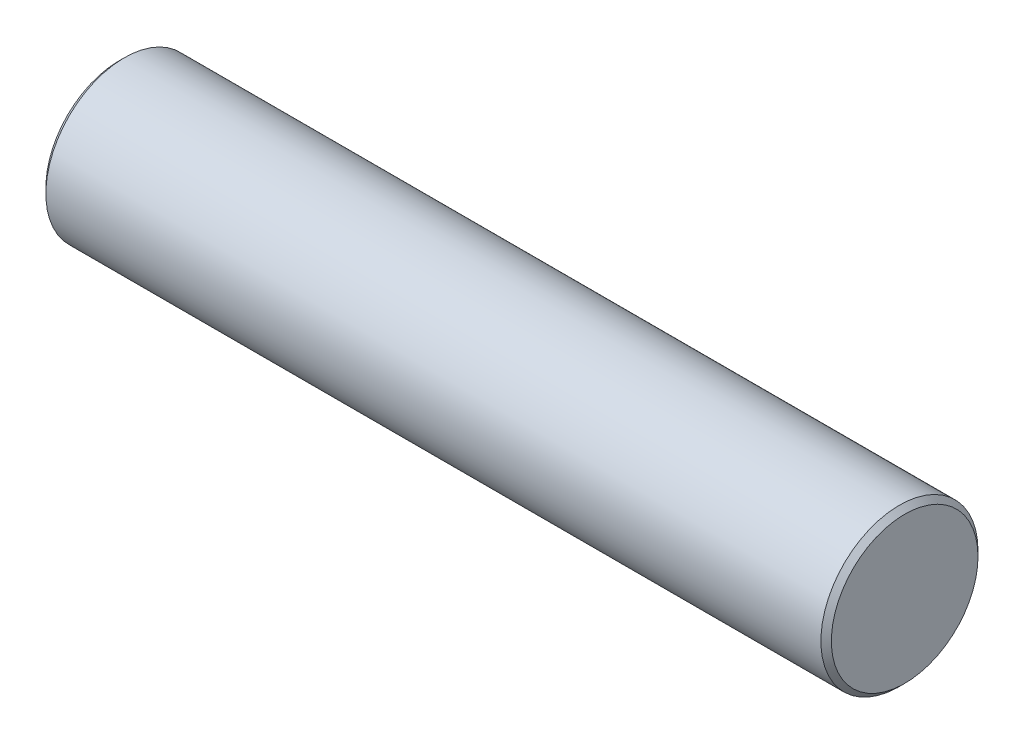
ISO-10303-21;
HEADER;
FILE_DESCRIPTION(('STEP AP214'),'2;1');
FILE_NAME('part.step','',(''),(''),'','','');
FILE_SCHEMA(('AUTOMOTIVE_DESIGN { 1 0 10303 214 1 1 1 1 }'));
ENDSEC;
DATA;
#1=APPLICATION_CONTEXT('core data for automotive mechanical design processes');
#2=APPLICATION_PROTOCOL_DEFINITION('international standard','automotive_design',2000,#1);
#3=PRODUCT_CONTEXT('',#1,'mechanical');
#4=PRODUCT('Part','Part','',(#3));
#5=PRODUCT_RELATED_PRODUCT_CATEGORY('part','',(#4));
#6=PRODUCT_DEFINITION_FORMATION('','',#4);
#7=PRODUCT_DEFINITION_CONTEXT('part definition',#1,'design');
#8=PRODUCT_DEFINITION('design','',#6,#7);
#9=PRODUCT_DEFINITION_SHAPE('','',#8);
#10=(LENGTH_UNIT() NAMED_UNIT(*) SI_UNIT(.MILLI.,.METRE.));
#11=(NAMED_UNIT(*) PLANE_ANGLE_UNIT() SI_UNIT($,.RADIAN.));
#12=(NAMED_UNIT(*) SI_UNIT($,.STERADIAN.) SOLID_ANGLE_UNIT());
#13=UNCERTAINTY_MEASURE_WITH_UNIT(LENGTH_MEASURE(1.E-05),#10,'distance_accuracy_value','');
#14=(GEOMETRIC_REPRESENTATION_CONTEXT(3) GLOBAL_UNCERTAINTY_ASSIGNED_CONTEXT((#13)) GLOBAL_UNIT_ASSIGNED_CONTEXT((#10,
#11,#12)) REPRESENTATION_CONTEXT('',''));
#15=CARTESIAN_POINT('',(0.,0.,0.));
#16=DIRECTION('',(0.,0.,1.));
#17=DIRECTION('',(1.,0.,0.));
#18=AXIS2_PLACEMENT_3D('',#15,#16,#17);
#19=CARTESIAN_POINT('',(7.5,0.,0.));
#20=DIRECTION('',(-1.,0.,0.));
#21=DIRECTION('',(0.,0.,1.));
#22=AXIS2_PLACEMENT_3D('',#19,#20,#21);
#23=CYLINDRICAL_SURFACE('',#22,1.5);
#24=CARTESIAN_POINT('',(-7.4,0.,0.));
#25=DIRECTION('',(1.,0.,0.));
#26=DIRECTION('',(0.,0.,-1.));
#27=AXIS2_PLACEMENT_3D('',#24,#25,#26);
#28=CIRCLE('',#27,1.5);
#29=CARTESIAN_POINT('',(-7.4,0.,-1.5));
#30=VERTEX_POINT('',#29);
#31=EDGE_CURVE('E49',#30,#30,#28,.T.);
#32=ORIENTED_EDGE('',*,*,#31,.T.);
#33=EDGE_LOOP('',(#32));
#34=FACE_BOUND('',#33,.T.);
#35=CARTESIAN_POINT('',(7.4,0.,0.));
#36=DIRECTION('',(1.,0.,0.));
#37=DIRECTION('',(0.,0.,-1.));
#38=AXIS2_PLACEMENT_3D('',#35,#36,#37);
#39=CIRCLE('',#38,1.5);
#40=CARTESIAN_POINT('',(7.4,0.,-1.5));
#41=VERTEX_POINT('',#40);
#42=EDGE_CURVE('E53',#41,#41,#39,.F.);
#43=ORIENTED_EDGE('',*,*,#42,.T.);
#44=EDGE_LOOP('',(#43));
#45=FACE_BOUND('',#44,.T.);
#46=ADVANCED_FACE('F37',(#34,#45),#23,.T.);
#47=CARTESIAN_POINT('',(7.5,0.,0.));
#48=DIRECTION('',(1.,0.,0.));
#49=DIRECTION('',(0.,0.,-1.));
#50=AXIS2_PLACEMENT_3D('',#47,#48,#49);
#51=PLANE('',#50);
#52=CARTESIAN_POINT('',(7.5,0.,0.));
#53=DIRECTION('',(1.,0.,0.));
#54=DIRECTION('',(0.,0.,-1.));
#55=AXIS2_PLACEMENT_3D('',#52,#53,#54);
#56=CIRCLE('',#55,1.4);
#57=CARTESIAN_POINT('',(7.5,0.,-1.4));
#58=VERTEX_POINT('',#57);
#59=EDGE_CURVE('E10',#58,#58,#56,.T.);
#60=ORIENTED_EDGE('',*,*,#59,.T.);
#61=EDGE_LOOP('',(#60));
#62=FACE_BOUND('',#61,.T.);
#63=ADVANCED_FACE('F69',(#62),#51,.T.);
#64=CARTESIAN_POINT('',(-7.5,0.,0.));
#65=DIRECTION('',(1.,0.,0.));
#66=DIRECTION('',(0.,0.,-1.));
#67=AXIS2_PLACEMENT_3D('',#64,#65,#66);
#68=PLANE('',#67);
#69=CARTESIAN_POINT('',(-7.5,0.,0.));
#70=DIRECTION('',(1.,0.,0.));
#71=DIRECTION('',(0.,0.,-1.));
#72=AXIS2_PLACEMENT_3D('',#69,#70,#71);
#73=CIRCLE('',#72,1.4);
#74=CARTESIAN_POINT('',(-7.5,0.,-1.4));
#75=VERTEX_POINT('',#74);
#76=EDGE_CURVE('E45',#75,#75,#73,.F.);
#77=ORIENTED_EDGE('',*,*,#76,.T.);
#78=EDGE_LOOP('',(#77));
#79=FACE_BOUND('',#78,.T.);
#80=ADVANCED_FACE('F66',(#79),#68,.F.);
#81=CARTESIAN_POINT('',(-7.4,0.,0.));
#82=DIRECTION('',(1.,0.,0.));
#83=DIRECTION('',(0.,0.,-1.));
#84=AXIS2_PLACEMENT_3D('',#81,#82,#83);
#85=CONICAL_SURFACE('',#84,1.5,0.785398163397443);
#86=ORIENTED_EDGE('',*,*,#76,.F.);
#87=EDGE_LOOP('',(#86));
#88=FACE_BOUND('',#87,.T.);
#89=ORIENTED_EDGE('',*,*,#31,.F.);
#90=EDGE_LOOP('',(#89));
#91=FACE_BOUND('',#90,.T.);
#92=ADVANCED_FACE('F62',(#88,#91),#85,.T.);
#93=CARTESIAN_POINT('',(7.5,0.,0.));
#94=DIRECTION('',(-1.,0.,0.));
#95=DIRECTION('',(0.,0.,1.));
#96=AXIS2_PLACEMENT_3D('',#93,#94,#95);
#97=CONICAL_SURFACE('',#96,1.4,0.785398163397448);
#98=ORIENTED_EDGE('',*,*,#42,.F.);
#99=EDGE_LOOP('',(#98));
#100=FACE_BOUND('',#99,.T.);
#101=ORIENTED_EDGE('',*,*,#59,.F.);
#102=EDGE_LOOP('',(#101));
#103=FACE_BOUND('',#102,.T.);
#104=ADVANCED_FACE('F40',(#100,#103),#97,.T.);
#105=CLOSED_SHELL('',(#46,#63,#80,#92,#104));
#106=MANIFOLD_SOLID_BREP('B2',#105);
#107=ADVANCED_BREP_SHAPE_REPRESENTATION('',(#18,#106),#14);
#108=SHAPE_DEFINITION_REPRESENTATION(#9,#107);
ENDSEC;
END-ISO-10303-21;
